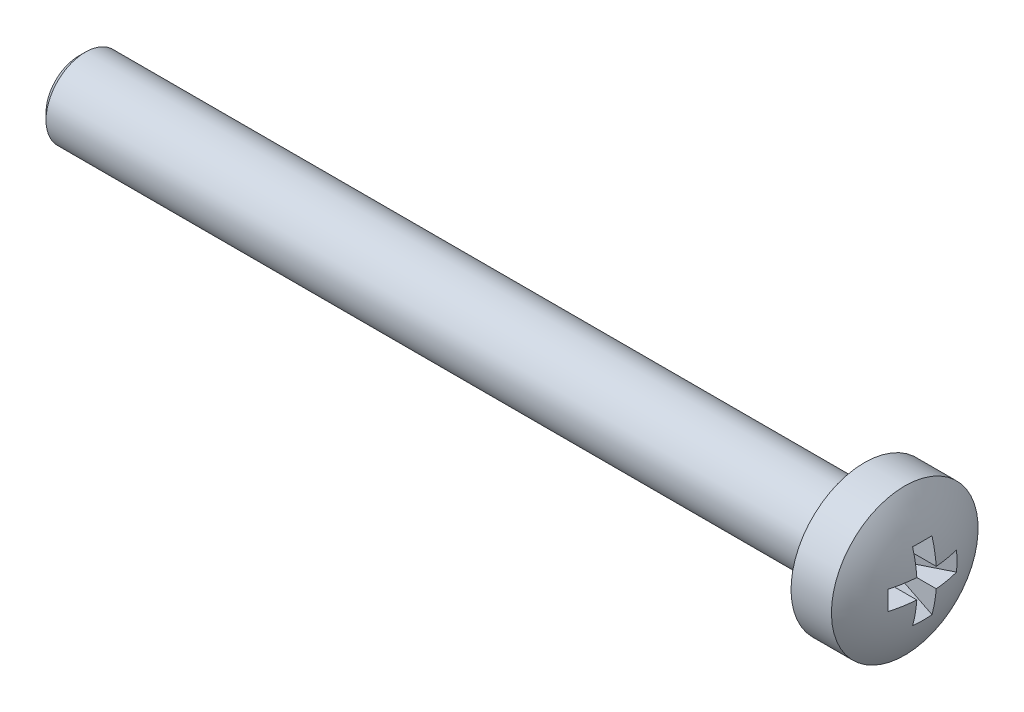
ISO-10303-21;
HEADER;
FILE_DESCRIPTION(('STEP AP214'),'2;1');
FILE_NAME('part.step','',(''),(''),'','','');
FILE_SCHEMA(('AUTOMOTIVE_DESIGN { 1 0 10303 214 1 1 1 1 }'));
ENDSEC;
DATA;
#1=APPLICATION_CONTEXT('core data for automotive mechanical design processes');
#2=APPLICATION_PROTOCOL_DEFINITION('international standard','automotive_design',2000,#1);
#3=PRODUCT_CONTEXT('',#1,'mechanical');
#4=PRODUCT('Part','Part','',(#3));
#5=PRODUCT_RELATED_PRODUCT_CATEGORY('part','',(#4));
#6=PRODUCT_DEFINITION_FORMATION('','',#4);
#7=PRODUCT_DEFINITION_CONTEXT('part definition',#1,'design');
#8=PRODUCT_DEFINITION('design','',#6,#7);
#9=PRODUCT_DEFINITION_SHAPE('','',#8);
#10=(LENGTH_UNIT() NAMED_UNIT(*) SI_UNIT(.MILLI.,.METRE.));
#11=(NAMED_UNIT(*) PLANE_ANGLE_UNIT() SI_UNIT($,.RADIAN.));
#12=(NAMED_UNIT(*) SI_UNIT($,.STERADIAN.) SOLID_ANGLE_UNIT());
#13=UNCERTAINTY_MEASURE_WITH_UNIT(LENGTH_MEASURE(1.E-05),#10,'distance_accuracy_value','');
#14=(GEOMETRIC_REPRESENTATION_CONTEXT(3) GLOBAL_UNCERTAINTY_ASSIGNED_CONTEXT((#13)) GLOBAL_UNIT_ASSIGNED_CONTEXT((#10,
#11,#12)) REPRESENTATION_CONTEXT('',''));
#15=CARTESIAN_POINT('',(0.,0.,0.));
#16=DIRECTION('',(0.,0.,1.));
#17=DIRECTION('',(1.,0.,0.));
#18=AXIS2_PLACEMENT_3D('',#15,#16,#17);
#19=CARTESIAN_POINT('',(-5.,0.,0.));
#20=DIRECTION('',(1.,0.,0.));
#21=DIRECTION('',(0.,-1.,0.));
#22=AXIS2_PLACEMENT_3D('',#19,#20,#21);
#23=SPHERICAL_SURFACE('',#22,5.);
#24=CARTESIAN_POINT('',(-4.56358241491322,0.,-0.875318258911803));
#25=DIRECTION('',(0.446197813109809,0.,-0.894934361602025));
#26=DIRECTION('',(-0.894934361602025,0.,-0.446197813109809));
#27=AXIS2_PLACEMENT_3D('',#24,#25,#26);
#28=CIRCLE('',#27,4.90340265907692);
#29=CARTESIAN_POINT('',(-0.187869730483241,0.37,1.3063316076711));
#30=VERTEX_POINT('',#29);
#31=CARTESIAN_POINT('',(-0.187869730483241,-0.37,1.3063316076711));
#32=VERTEX_POINT('',#31);
#33=EDGE_CURVE('E195',#30,#32,#28,.T.);
#34=ORIENTED_EDGE('',*,*,#33,.F.);
#35=CARTESIAN_POINT('',(-5.,0.37,0.));
#36=DIRECTION('',(0.,-1.,0.));
#37=DIRECTION('',(0.,0.,-1.));
#38=AXIS2_PLACEMENT_3D('',#35,#36,#37);
#39=CIRCLE('',#38,4.98629120689917);
#40=CARTESIAN_POINT('',(-0.0274553797879303,0.37,0.37));
#41=VERTEX_POINT('',#40);
#42=EDGE_CURVE('E114',#30,#41,#39,.F.);
#43=ORIENTED_EDGE('',*,*,#42,.T.);
#44=CARTESIAN_POINT('',(-5.,0.,0.37));
#45=DIRECTION('',(0.,0.,1.));
#46=DIRECTION('',(0.,-1.,0.));
#47=AXIS2_PLACEMENT_3D('',#44,#45,#46);
#48=CIRCLE('',#47,4.98629120689917);
#49=CARTESIAN_POINT('',(-0.187869730483241,1.3063316076711,0.37));
#50=VERTEX_POINT('',#49);
#51=EDGE_CURVE('E146',#50,#41,#48,.F.);
#52=ORIENTED_EDGE('',*,*,#51,.F.);
#53=CARTESIAN_POINT('',(-4.56358241491322,-0.875318258911803,0.));
#54=DIRECTION('',(0.446197813109809,-0.894934361602025,0.));
#55=DIRECTION('',(0.894934361602025,0.446197813109809,0.));
#56=AXIS2_PLACEMENT_3D('',#53,#54,#55);
#57=CIRCLE('',#56,4.90340265907692);
#58=CARTESIAN_POINT('',(-0.187869730483241,1.3063316076711,-0.37));
#59=VERTEX_POINT('',#58);
#60=EDGE_CURVE('E143',#50,#59,#57,.F.);
#61=ORIENTED_EDGE('',*,*,#60,.T.);
#62=CARTESIAN_POINT('',(-5.,0.,-0.37));
#63=DIRECTION('',(0.,0.,1.));
#64=DIRECTION('',(0.,-1.,0.));
#65=AXIS2_PLACEMENT_3D('',#62,#63,#64);
#66=CIRCLE('',#65,4.98629120689917);
#67=CARTESIAN_POINT('',(-0.0274553797879303,0.37,-0.37));
#68=VERTEX_POINT('',#67);
#69=EDGE_CURVE('E147',#59,#68,#66,.F.);
#70=ORIENTED_EDGE('',*,*,#69,.T.);
#71=CARTESIAN_POINT('',(-5.,0.37,0.));
#72=DIRECTION('',(0.,-1.,0.));
#73=DIRECTION('',(0.,0.,-1.));
#74=AXIS2_PLACEMENT_3D('',#71,#72,#73);
#75=CIRCLE('',#74,4.98629120689917);
#76=CARTESIAN_POINT('',(-0.187869730483241,0.37,-1.3063316076711));
#77=VERTEX_POINT('',#76);
#78=EDGE_CURVE('E197',#68,#77,#75,.F.);
#79=ORIENTED_EDGE('',*,*,#78,.T.);
#80=CARTESIAN_POINT('',(-4.56358241491322,0.,0.875318258911803));
#81=DIRECTION('',(0.446197813109809,0.,0.894934361602025));
#82=DIRECTION('',(0.894934361602025,0.,-0.446197813109809));
#83=AXIS2_PLACEMENT_3D('',#80,#81,#82);
#84=CIRCLE('',#83,4.90340265907692);
#85=CARTESIAN_POINT('',(-0.187869730483241,-0.37,-1.3063316076711));
#86=VERTEX_POINT('',#85);
#87=EDGE_CURVE('E200',#77,#86,#84,.F.);
#88=ORIENTED_EDGE('',*,*,#87,.T.);
#89=CARTESIAN_POINT('',(-5.,-0.37,0.));
#90=DIRECTION('',(0.,-1.,0.));
#91=DIRECTION('',(0.,0.,-1.));
#92=AXIS2_PLACEMENT_3D('',#89,#90,#91);
#93=CIRCLE('',#92,4.98629120689917);
#94=CARTESIAN_POINT('',(-0.0274553797879303,-0.37,-0.37));
#95=VERTEX_POINT('',#94);
#96=EDGE_CURVE('E201',#95,#86,#93,.F.);
#97=ORIENTED_EDGE('',*,*,#96,.F.);
#98=CARTESIAN_POINT('',(-5.,0.,-0.37));
#99=DIRECTION('',(0.,0.,1.));
#100=DIRECTION('',(0.,-1.,0.));
#101=AXIS2_PLACEMENT_3D('',#98,#99,#100);
#102=CIRCLE('',#101,4.98629120689917);
#103=CARTESIAN_POINT('',(-0.187869730483241,-1.3063316076711,-0.37));
#104=VERTEX_POINT('',#103);
#105=EDGE_CURVE('E157',#95,#104,#102,.F.);
#106=ORIENTED_EDGE('',*,*,#105,.T.);
#107=CARTESIAN_POINT('',(-4.56358241491322,0.875318258911802,0.));
#108=DIRECTION('',(0.446197813109809,0.894934361602025,0.));
#109=DIRECTION('',(-0.894934361602025,0.446197813109809,0.));
#110=AXIS2_PLACEMENT_3D('',#107,#108,#109);
#111=CIRCLE('',#110,4.90340265907692);
#112=CARTESIAN_POINT('',(-0.187869730483241,-1.3063316076711,0.37));
#113=VERTEX_POINT('',#112);
#114=EDGE_CURVE('E154',#113,#104,#111,.T.);
#115=ORIENTED_EDGE('',*,*,#114,.F.);
#116=CARTESIAN_POINT('',(-5.,0.,0.37));
#117=DIRECTION('',(0.,0.,1.));
#118=DIRECTION('',(0.,-1.,0.));
#119=AXIS2_PLACEMENT_3D('',#116,#117,#118);
#120=CIRCLE('',#119,4.98629120689917);
#121=CARTESIAN_POINT('',(-0.0274553797879303,-0.37,0.37));
#122=VERTEX_POINT('',#121);
#123=EDGE_CURVE('E158',#122,#113,#120,.F.);
#124=ORIENTED_EDGE('',*,*,#123,.F.);
#125=CARTESIAN_POINT('',(-5.,-0.37,0.));
#126=DIRECTION('',(0.,-1.,0.));
#127=DIRECTION('',(0.,0.,-1.));
#128=AXIS2_PLACEMENT_3D('',#125,#126,#127);
#129=CIRCLE('',#128,4.98629120689917);
#130=EDGE_CURVE('E193',#32,#122,#129,.F.);
#131=ORIENTED_EDGE('',*,*,#130,.F.);
#132=EDGE_LOOP('',(#34,#43,#52,#61,#70,#79,#88,#97,#106,#115,#124,#131));
#133=FACE_BOUND('',#132,.T.);
#134=CARTESIAN_POINT('',(-0.857536964558404,0.,0.));
#135=DIRECTION('',(1.,0.,0.));
#136=DIRECTION('',(0.,1.,0.));
#137=AXIS2_PLACEMENT_3D('',#134,#135,#136);
#138=CIRCLE('',#137,2.8);
#139=CARTESIAN_POINT('',(-0.857536964558404,2.8,0.));
#140=VERTEX_POINT('',#139);
#141=EDGE_CURVE('E118',#140,#140,#138,.T.);
#142=ORIENTED_EDGE('',*,*,#141,.T.);
#143=EDGE_LOOP('',(#142));
#144=FACE_BOUND('',#143,.T.);
#145=ADVANCED_FACE('F16',(#133,#144),#23,.T.);
#146=CARTESIAN_POINT('',(-32.4,0.,0.));
#147=DIRECTION('',(-1.,0.,0.));
#148=DIRECTION('',(0.,-1.,0.));
#149=AXIS2_PLACEMENT_3D('',#146,#147,#148);
#150=PLANE('',#149);
#151=CARTESIAN_POINT('',(-32.4,0.,0.));
#152=DIRECTION('',(-1.,0.,0.));
#153=DIRECTION('',(0.,-1.,0.));
#154=AXIS2_PLACEMENT_3D('',#151,#152,#153);
#155=CIRCLE('',#154,1.25);
#156=CARTESIAN_POINT('',(-32.4,-1.25,0.));
#157=VERTEX_POINT('',#156);
#158=EDGE_CURVE('E11',#157,#157,#155,.T.);
#159=ORIENTED_EDGE('',*,*,#158,.T.);
#160=EDGE_LOOP('',(#159));
#161=FACE_BOUND('',#160,.T.);
#162=ADVANCED_FACE('F262',(#161),#150,.T.);
#163=CARTESIAN_POINT('',(0.,0.,0.));
#164=DIRECTION('',(1.,0.,0.));
#165=DIRECTION('',(0.,1.,0.));
#166=AXIS2_PLACEMENT_3D('',#163,#164,#165);
#167=CYLINDRICAL_SURFACE('',#166,1.5);
#168=CARTESIAN_POINT('',(-32.15,0.,0.));
#169=DIRECTION('',(-1.,0.,0.));
#170=DIRECTION('',(0.,-1.,0.));
#171=AXIS2_PLACEMENT_3D('',#168,#169,#170);
#172=CIRCLE('',#171,1.5);
#173=CARTESIAN_POINT('',(-32.15,-1.5,0.));
#174=VERTEX_POINT('',#173);
#175=EDGE_CURVE('E26',#174,#174,#172,.F.);
#176=ORIENTED_EDGE('',*,*,#175,.T.);
#177=EDGE_LOOP('',(#176));
#178=FACE_BOUND('',#177,.T.);
#179=CARTESIAN_POINT('',(-2.4,0.,0.));
#180=DIRECTION('',(1.,0.,0.));
#181=DIRECTION('',(0.,1.,0.));
#182=AXIS2_PLACEMENT_3D('',#179,#180,#181);
#183=CIRCLE('',#182,1.5);
#184=CARTESIAN_POINT('',(-2.4,1.5,0.));
#185=VERTEX_POINT('',#184);
#186=EDGE_CURVE('E190',#185,#185,#183,.T.);
#187=ORIENTED_EDGE('',*,*,#186,.F.);
#188=EDGE_LOOP('',(#187));
#189=FACE_BOUND('',#188,.T.);
#190=ADVANCED_FACE('F268',(#178,#189),#167,.T.);
#191=CARTESIAN_POINT('',(-2.4,1.5,0.));
#192=DIRECTION('',(-1.,0.,0.));
#193=DIRECTION('',(0.,-1.,0.));
#194=AXIS2_PLACEMENT_3D('',#191,#192,#193);
#195=PLANE('',#194);
#196=ORIENTED_EDGE('',*,*,#186,.T.);
#197=EDGE_LOOP('',(#196));
#198=FACE_BOUND('',#197,.T.);
#199=CARTESIAN_POINT('',(-2.4,0.,0.));
#200=DIRECTION('',(1.,0.,0.));
#201=DIRECTION('',(0.,1.,0.));
#202=AXIS2_PLACEMENT_3D('',#199,#200,#201);
#203=CIRCLE('',#202,2.8);
#204=CARTESIAN_POINT('',(-2.4,2.8,0.));
#205=VERTEX_POINT('',#204);
#206=EDGE_CURVE('E187',#205,#205,#203,.T.);
#207=ORIENTED_EDGE('',*,*,#206,.F.);
#208=EDGE_LOOP('',(#207));
#209=FACE_BOUND('',#208,.T.);
#210=ADVANCED_FACE('F299',(#198,#209),#195,.T.);
#211=CARTESIAN_POINT('',(0.,0.,0.));
#212=DIRECTION('',(1.,0.,0.));
#213=DIRECTION('',(0.,1.,0.));
#214=AXIS2_PLACEMENT_3D('',#211,#212,#213);
#215=CYLINDRICAL_SURFACE('',#214,2.8);
#216=ORIENTED_EDGE('',*,*,#206,.T.);
#217=EDGE_LOOP('',(#216));
#218=FACE_BOUND('',#217,.T.);
#219=ORIENTED_EDGE('',*,*,#141,.F.);
#220=EDGE_LOOP('',(#219));
#221=FACE_BOUND('',#220,.T.);
#222=ADVANCED_FACE('F296',(#218,#221),#215,.T.);
#223=CARTESIAN_POINT('',(0.,0.,1.4));
#224=DIRECTION('',(0.446197813109809,0.,-0.894934361602025));
#225=DIRECTION('',(-0.894934361602025,0.,-0.446197813109809));
#226=AXIS2_PLACEMENT_3D('',#223,#224,#225);
#227=PLANE('',#226);
#228=ORIENTED_EDGE('',*,*,#33,.T.);
#229=DIRECTION('',(-0.894934361602025,0.,-0.446197813109809));
#230=VECTOR('',#229,1.);
#231=CARTESIAN_POINT('',(0.,-0.37,1.4));
#232=LINE('',#231,#230);
#233=CARTESIAN_POINT('',(-1.75,-0.37,0.527482185906493));
#234=VERTEX_POINT('',#233);
#235=EDGE_CURVE('E35',#234,#32,#232,.F.);
#236=ORIENTED_EDGE('',*,*,#235,.F.);
#237=DIRECTION('',(0.,1.,0.));
#238=VECTOR('',#237,1.);
#239=CARTESIAN_POINT('',(-1.75,0.,0.527482185906493));
#240=LINE('',#239,#238);
#241=CARTESIAN_POINT('',(-1.75,0.37,0.527482185906493));
#242=VERTEX_POINT('',#241);
#243=EDGE_CURVE('E126',#242,#234,#240,.F.);
#244=ORIENTED_EDGE('',*,*,#243,.F.);
#245=DIRECTION('',(-0.894934361602025,0.,-0.446197813109809));
#246=VECTOR('',#245,1.);
#247=CARTESIAN_POINT('',(0.,0.37,1.4));
#248=LINE('',#247,#246);
#249=EDGE_CURVE('E107',#242,#30,#248,.F.);
#250=ORIENTED_EDGE('',*,*,#249,.T.);
#251=EDGE_LOOP('',(#228,#236,#244,#250));
#252=FACE_BOUND('',#251,.T.);
#253=ADVANCED_FACE('F18',(#252),#227,.T.);
#254=CARTESIAN_POINT('',(-1.75,0.37,0.));
#255=DIRECTION('',(0.,-1.,0.));
#256=DIRECTION('',(0.,0.,-1.));
#257=AXIS2_PLACEMENT_3D('',#254,#255,#256);
#258=PLANE('',#257);
#259=ORIENTED_EDGE('',*,*,#249,.F.);
#260=DIRECTION('',(0.,0.,-1.));
#261=VECTOR('',#260,1.);
#262=CARTESIAN_POINT('',(-1.75,0.37,0.));
#263=LINE('',#262,#261);
#264=CARTESIAN_POINT('',(-1.75,0.37,0.37));
#265=VERTEX_POINT('',#264);
#266=EDGE_CURVE('E111',#242,#265,#263,.T.);
#267=ORIENTED_EDGE('',*,*,#266,.T.);
#268=DIRECTION('',(1.,0.,0.));
#269=VECTOR('',#268,1.);
#270=CARTESIAN_POINT('',(-1.75,0.37,0.37));
#271=LINE('',#270,#269);
#272=EDGE_CURVE('E119',#265,#41,#271,.T.);
#273=ORIENTED_EDGE('',*,*,#272,.T.);
#274=ORIENTED_EDGE('',*,*,#42,.F.);
#275=EDGE_LOOP('',(#259,#267,#273,#274));
#276=FACE_BOUND('',#275,.T.);
#277=ADVANCED_FACE('F109',(#276),#258,.T.);
#278=CARTESIAN_POINT('',(-1.75,0.,0.37));
#279=DIRECTION('',(0.,0.,1.));
#280=DIRECTION('',(0.,-1.,0.));
#281=AXIS2_PLACEMENT_3D('',#278,#279,#280);
#282=PLANE('',#281);
#283=ORIENTED_EDGE('',*,*,#51,.T.);
#284=ORIENTED_EDGE('',*,*,#272,.F.);
#285=DIRECTION('',(0.,-1.,0.));
#286=VECTOR('',#285,1.);
#287=CARTESIAN_POINT('',(-1.75,0.,0.37));
#288=LINE('',#287,#286);
#289=CARTESIAN_POINT('',(-1.75,0.527482185906492,0.37));
#290=VERTEX_POINT('',#289);
#291=EDGE_CURVE('E129',#290,#265,#288,.T.);
#292=ORIENTED_EDGE('',*,*,#291,.F.);
#293=DIRECTION('',(0.894934361602025,0.446197813109809,0.));
#294=VECTOR('',#293,1.);
#295=CARTESIAN_POINT('',(-1.96063300229114,0.42246444491505,0.37));
#296=LINE('',#295,#294);
#297=EDGE_CURVE('E139',#290,#50,#296,.T.);
#298=ORIENTED_EDGE('',*,*,#297,.T.);
#299=EDGE_LOOP('',(#283,#284,#292,#298));
#300=FACE_BOUND('',#299,.T.);
#301=ADVANCED_FACE('F250',(#300),#282,.F.);
#302=CARTESIAN_POINT('',(0.,1.4,0.));
#303=DIRECTION('',(0.446197813109809,-0.894934361602025,0.));
#304=DIRECTION('',(0.894934361602025,0.446197813109809,0.));
#305=AXIS2_PLACEMENT_3D('',#302,#303,#304);
#306=PLANE('',#305);
#307=ORIENTED_EDGE('',*,*,#297,.F.);
#308=DIRECTION('',(0.,0.,-1.));
#309=VECTOR('',#308,1.);
#310=CARTESIAN_POINT('',(-1.75,0.527482185906492,0.));
#311=LINE('',#310,#309);
#312=CARTESIAN_POINT('',(-1.75,0.527482185906492,-0.37));
#313=VERTEX_POINT('',#312);
#314=EDGE_CURVE('E151',#290,#313,#311,.T.);
#315=ORIENTED_EDGE('',*,*,#314,.T.);
#316=DIRECTION('',(0.894934361602025,0.446197813109809,0.));
#317=VECTOR('',#316,1.);
#318=CARTESIAN_POINT('',(-1.96063300229114,0.42246444491505,-0.37));
#319=LINE('',#318,#317);
#320=EDGE_CURVE('E142',#313,#59,#319,.T.);
#321=ORIENTED_EDGE('',*,*,#320,.T.);
#322=ORIENTED_EDGE('',*,*,#60,.F.);
#323=EDGE_LOOP('',(#307,#315,#321,#322));
#324=FACE_BOUND('',#323,.T.);
#325=ADVANCED_FACE('F248',(#324),#306,.T.);
#326=CARTESIAN_POINT('',(-1.75,0.,-0.37));
#327=DIRECTION('',(0.,0.,1.));
#328=DIRECTION('',(0.,-1.,0.));
#329=AXIS2_PLACEMENT_3D('',#326,#327,#328);
#330=PLANE('',#329);
#331=ORIENTED_EDGE('',*,*,#320,.F.);
#332=DIRECTION('',(0.,-1.,0.));
#333=VECTOR('',#332,1.);
#334=CARTESIAN_POINT('',(-1.75,0.,-0.37));
#335=LINE('',#334,#333);
#336=CARTESIAN_POINT('',(-1.75,0.37,-0.37));
#337=VERTEX_POINT('',#336);
#338=EDGE_CURVE('E153',#313,#337,#335,.T.);
#339=ORIENTED_EDGE('',*,*,#338,.T.);
#340=DIRECTION('',(1.,0.,0.));
#341=VECTOR('',#340,1.);
#342=CARTESIAN_POINT('',(-1.75,0.37,-0.37));
#343=LINE('',#342,#341);
#344=EDGE_CURVE('E150',#337,#68,#343,.T.);
#345=ORIENTED_EDGE('',*,*,#344,.T.);
#346=ORIENTED_EDGE('',*,*,#69,.F.);
#347=EDGE_LOOP('',(#331,#339,#345,#346));
#348=FACE_BOUND('',#347,.T.);
#349=ADVANCED_FACE('F245',(#348),#330,.T.);
#350=CARTESIAN_POINT('',(-1.75,0.37,0.));
#351=DIRECTION('',(0.,-1.,0.));
#352=DIRECTION('',(0.,0.,-1.));
#353=AXIS2_PLACEMENT_3D('',#350,#351,#352);
#354=PLANE('',#353);
#355=ORIENTED_EDGE('',*,*,#344,.F.);
#356=DIRECTION('',(0.,0.,-1.));
#357=VECTOR('',#356,1.);
#358=CARTESIAN_POINT('',(-1.75,0.37,0.));
#359=LINE('',#358,#357);
#360=CARTESIAN_POINT('',(-1.75,0.37,-0.527482185906493));
#361=VERTEX_POINT('',#360);
#362=EDGE_CURVE('E173',#337,#361,#359,.T.);
#363=ORIENTED_EDGE('',*,*,#362,.T.);
#364=DIRECTION('',(0.894934361602025,0.,-0.446197813109809));
#365=VECTOR('',#364,1.);
#366=CARTESIAN_POINT('',(0.,0.37,-1.4));
#367=LINE('',#366,#365);
#368=EDGE_CURVE('E180',#361,#77,#367,.T.);
#369=ORIENTED_EDGE('',*,*,#368,.T.);
#370=ORIENTED_EDGE('',*,*,#78,.F.);
#371=EDGE_LOOP('',(#355,#363,#369,#370));
#372=FACE_BOUND('',#371,.T.);
#373=ADVANCED_FACE('F242',(#372),#354,.T.);
#374=CARTESIAN_POINT('',(0.,0.,-1.4));
#375=DIRECTION('',(0.446197813109809,0.,0.894934361602025));
#376=DIRECTION('',(0.894934361602025,0.,-0.446197813109809));
#377=AXIS2_PLACEMENT_3D('',#374,#375,#376);
#378=PLANE('',#377);
#379=ORIENTED_EDGE('',*,*,#368,.F.);
#380=DIRECTION('',(0.,-1.,0.));
#381=VECTOR('',#380,1.);
#382=CARTESIAN_POINT('',(-1.75,0.,-0.527482185906493));
#383=LINE('',#382,#381);
#384=CARTESIAN_POINT('',(-1.75,-0.37,-0.527482185906493));
#385=VERTEX_POINT('',#384);
#386=EDGE_CURVE('E172',#361,#385,#383,.T.);
#387=ORIENTED_EDGE('',*,*,#386,.T.);
#388=DIRECTION('',(0.894934361602025,0.,-0.446197813109809));
#389=VECTOR('',#388,1.);
#390=CARTESIAN_POINT('',(0.,-0.37,-1.4));
#391=LINE('',#390,#389);
#392=EDGE_CURVE('E182',#385,#86,#391,.T.);
#393=ORIENTED_EDGE('',*,*,#392,.T.);
#394=ORIENTED_EDGE('',*,*,#87,.F.);
#395=EDGE_LOOP('',(#379,#387,#393,#394));
#396=FACE_BOUND('',#395,.T.);
#397=ADVANCED_FACE('F236',(#396),#378,.T.);
#398=CARTESIAN_POINT('',(-1.75,-0.37,0.));
#399=DIRECTION('',(0.,-1.,0.));
#400=DIRECTION('',(0.,0.,-1.));
#401=AXIS2_PLACEMENT_3D('',#398,#399,#400);
#402=PLANE('',#401);
#403=ORIENTED_EDGE('',*,*,#96,.T.);
#404=ORIENTED_EDGE('',*,*,#392,.F.);
#405=DIRECTION('',(0.,0.,-1.));
#406=VECTOR('',#405,1.);
#407=CARTESIAN_POINT('',(-1.75,-0.37,0.));
#408=LINE('',#407,#406);
#409=CARTESIAN_POINT('',(-1.75,-0.37,-0.37));
#410=VERTEX_POINT('',#409);
#411=EDGE_CURVE('E165',#410,#385,#408,.T.);
#412=ORIENTED_EDGE('',*,*,#411,.F.);
#413=DIRECTION('',(1.,0.,0.));
#414=VECTOR('',#413,1.);
#415=CARTESIAN_POINT('',(-1.75,-0.37,-0.37));
#416=LINE('',#415,#414);
#417=EDGE_CURVE('E79',#410,#95,#416,.T.);
#418=ORIENTED_EDGE('',*,*,#417,.T.);
#419=EDGE_LOOP('',(#403,#404,#412,#418));
#420=FACE_BOUND('',#419,.T.);
#421=ADVANCED_FACE('F232',(#420),#402,.F.);
#422=CARTESIAN_POINT('',(-1.75,0.,-0.37));
#423=DIRECTION('',(0.,0.,1.));
#424=DIRECTION('',(0.,-1.,0.));
#425=AXIS2_PLACEMENT_3D('',#422,#423,#424);
#426=PLANE('',#425);
#427=ORIENTED_EDGE('',*,*,#417,.F.);
#428=DIRECTION('',(0.,-1.,0.));
#429=VECTOR('',#428,1.);
#430=CARTESIAN_POINT('',(-1.75,0.,-0.37));
#431=LINE('',#430,#429);
#432=CARTESIAN_POINT('',(-1.75,-0.527482185906493,-0.37));
#433=VERTEX_POINT('',#432);
#434=EDGE_CURVE('E73',#410,#433,#431,.T.);
#435=ORIENTED_EDGE('',*,*,#434,.T.);
#436=DIRECTION('',(-0.894934361602025,0.446197813109809,0.));
#437=VECTOR('',#436,1.);
#438=CARTESIAN_POINT('',(-1.96063300229114,-0.42246444491505,-0.37));
#439=LINE('',#438,#437);
#440=EDGE_CURVE('E20',#433,#104,#439,.F.);
#441=ORIENTED_EDGE('',*,*,#440,.T.);
#442=ORIENTED_EDGE('',*,*,#105,.F.);
#443=EDGE_LOOP('',(#427,#435,#441,#442));
#444=FACE_BOUND('',#443,.T.);
#445=ADVANCED_FACE('F228',(#444),#426,.T.);
#446=CARTESIAN_POINT('',(0.,-1.4,0.));
#447=DIRECTION('',(0.446197813109809,0.894934361602025,0.));
#448=DIRECTION('',(-0.894934361602025,0.446197813109809,0.));
#449=AXIS2_PLACEMENT_3D('',#446,#447,#448);
#450=PLANE('',#449);
#451=ORIENTED_EDGE('',*,*,#114,.T.);
#452=ORIENTED_EDGE('',*,*,#440,.F.);
#453=DIRECTION('',(0.,0.,1.));
#454=VECTOR('',#453,1.);
#455=CARTESIAN_POINT('',(-1.75,-0.527482185906493,0.));
#456=LINE('',#455,#454);
#457=CARTESIAN_POINT('',(-1.75,-0.527482185906493,0.37));
#458=VERTEX_POINT('',#457);
#459=EDGE_CURVE('E161',#458,#433,#456,.F.);
#460=ORIENTED_EDGE('',*,*,#459,.F.);
#461=DIRECTION('',(-0.894934361602025,0.446197813109809,0.));
#462=VECTOR('',#461,1.);
#463=CARTESIAN_POINT('',(-1.96063300229114,-0.42246444491505,0.37));
#464=LINE('',#463,#462);
#465=EDGE_CURVE('E159',#458,#113,#464,.F.);
#466=ORIENTED_EDGE('',*,*,#465,.T.);
#467=EDGE_LOOP('',(#451,#452,#460,#466));
#468=FACE_BOUND('',#467,.T.);
#469=ADVANCED_FACE('F227',(#468),#450,.T.);
#470=CARTESIAN_POINT('',(-1.75,0.,0.37));
#471=DIRECTION('',(0.,0.,1.));
#472=DIRECTION('',(0.,-1.,0.));
#473=AXIS2_PLACEMENT_3D('',#470,#471,#472);
#474=PLANE('',#473);
#475=ORIENTED_EDGE('',*,*,#123,.T.);
#476=ORIENTED_EDGE('',*,*,#465,.F.);
#477=DIRECTION('',(0.,-1.,0.));
#478=VECTOR('',#477,1.);
#479=CARTESIAN_POINT('',(-1.75,0.,0.37));
#480=LINE('',#479,#478);
#481=CARTESIAN_POINT('',(-1.75,-0.37,0.37));
#482=VERTEX_POINT('',#481);
#483=EDGE_CURVE('E133',#482,#458,#480,.T.);
#484=ORIENTED_EDGE('',*,*,#483,.F.);
#485=DIRECTION('',(1.,0.,0.));
#486=VECTOR('',#485,1.);
#487=CARTESIAN_POINT('',(-1.75,-0.37,0.37));
#488=LINE('',#487,#486);
#489=EDGE_CURVE('E138',#482,#122,#488,.T.);
#490=ORIENTED_EDGE('',*,*,#489,.T.);
#491=EDGE_LOOP('',(#475,#476,#484,#490));
#492=FACE_BOUND('',#491,.T.);
#493=ADVANCED_FACE('F225',(#492),#474,.F.);
#494=CARTESIAN_POINT('',(-1.75,-0.37,0.));
#495=DIRECTION('',(0.,-1.,0.));
#496=DIRECTION('',(0.,0.,-1.));
#497=AXIS2_PLACEMENT_3D('',#494,#495,#496);
#498=PLANE('',#497);
#499=ORIENTED_EDGE('',*,*,#130,.T.);
#500=ORIENTED_EDGE('',*,*,#489,.F.);
#501=DIRECTION('',(0.,0.,-1.));
#502=VECTOR('',#501,1.);
#503=CARTESIAN_POINT('',(-1.75,-0.37,0.));
#504=LINE('',#503,#502);
#505=EDGE_CURVE('E131',#234,#482,#504,.T.);
#506=ORIENTED_EDGE('',*,*,#505,.F.);
#507=ORIENTED_EDGE('',*,*,#235,.T.);
#508=EDGE_LOOP('',(#499,#500,#506,#507));
#509=FACE_BOUND('',#508,.T.);
#510=ADVANCED_FACE('F223',(#509),#498,.F.);
#511=CARTESIAN_POINT('',(-1.75,0.,0.));
#512=DIRECTION('',(1.,0.,0.));
#513=DIRECTION('',(0.,0.,-1.));
#514=AXIS2_PLACEMENT_3D('',#511,#512,#513);
#515=PLANE('',#514);
#516=ORIENTED_EDGE('',*,*,#243,.T.);
#517=ORIENTED_EDGE('',*,*,#505,.T.);
#518=ORIENTED_EDGE('',*,*,#483,.T.);
#519=ORIENTED_EDGE('',*,*,#459,.T.);
#520=ORIENTED_EDGE('',*,*,#434,.F.);
#521=ORIENTED_EDGE('',*,*,#411,.T.);
#522=ORIENTED_EDGE('',*,*,#386,.F.);
#523=ORIENTED_EDGE('',*,*,#362,.F.);
#524=ORIENTED_EDGE('',*,*,#338,.F.);
#525=ORIENTED_EDGE('',*,*,#314,.F.);
#526=ORIENTED_EDGE('',*,*,#291,.T.);
#527=ORIENTED_EDGE('',*,*,#266,.F.);
#528=EDGE_LOOP('',(#516,#517,#518,#519,#520,#521,#522,#523,#524,#525,#526,#527));
#529=FACE_BOUND('',#528,.T.);
#530=ADVANCED_FACE('F124',(#529),#515,.T.);
#531=CARTESIAN_POINT('',(-32.15,0.,0.));
#532=DIRECTION('',(1.,0.,0.));
#533=DIRECTION('',(0.,1.,0.));
#534=AXIS2_PLACEMENT_3D('',#531,#532,#533);
#535=CONICAL_SURFACE('',#534,1.5,0.785398163397445);
#536=ORIENTED_EDGE('',*,*,#158,.F.);
#537=EDGE_LOOP('',(#536));
#538=FACE_BOUND('',#537,.T.);
#539=ORIENTED_EDGE('',*,*,#175,.F.);
#540=EDGE_LOOP('',(#539));
#541=FACE_BOUND('',#540,.T.);
#542=ADVANCED_FACE('F273',(#538,#541),#535,.T.);
#543=CLOSED_SHELL('',(#145,#162,#190,#210,#222,#253,#277,#301,#325,#349,#373,#397,#421,#445,
#469,#493,#510,#530,#542));
#544=MANIFOLD_SOLID_BREP('B1',#543);
#545=ADVANCED_BREP_SHAPE_REPRESENTATION('',(#18,#544),#14);
#546=SHAPE_DEFINITION_REPRESENTATION(#9,#545);
ENDSEC;
END-ISO-10303-21;
